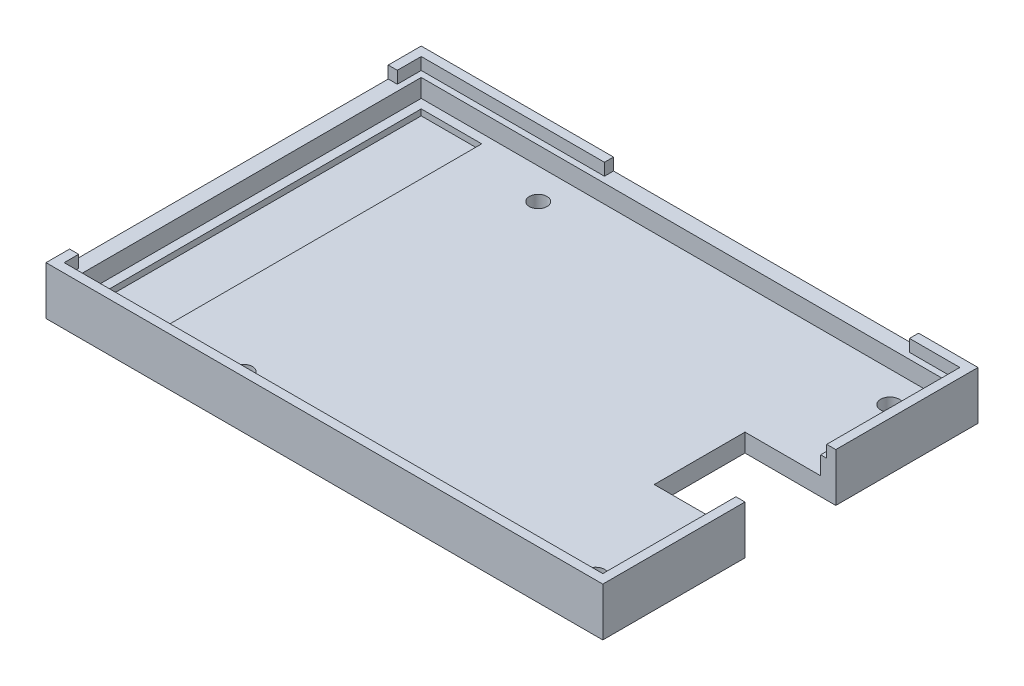
ISO-10303-21;
HEADER;
FILE_DESCRIPTION(('STEP AP214'),'2;1');
FILE_NAME('part.step','',(''),(''),'','','');
FILE_SCHEMA(('AUTOMOTIVE_DESIGN { 1 0 10303 214 1 1 1 1 }'));
ENDSEC;
DATA;
#1=APPLICATION_CONTEXT('core data for automotive mechanical design processes');
#2=APPLICATION_PROTOCOL_DEFINITION('international standard','automotive_design',2000,#1);
#3=PRODUCT_CONTEXT('',#1,'mechanical');
#4=PRODUCT('Part','Part','',(#3));
#5=PRODUCT_RELATED_PRODUCT_CATEGORY('part','',(#4));
#6=PRODUCT_DEFINITION_FORMATION('','',#4);
#7=PRODUCT_DEFINITION_CONTEXT('part definition',#1,'design');
#8=PRODUCT_DEFINITION('design','',#6,#7);
#9=PRODUCT_DEFINITION_SHAPE('','',#8);
#10=(LENGTH_UNIT() NAMED_UNIT(*) SI_UNIT(.MILLI.,.METRE.));
#11=(NAMED_UNIT(*) PLANE_ANGLE_UNIT() SI_UNIT($,.RADIAN.));
#12=(NAMED_UNIT(*) SI_UNIT($,.STERADIAN.) SOLID_ANGLE_UNIT());
#13=UNCERTAINTY_MEASURE_WITH_UNIT(LENGTH_MEASURE(1.E-05),#10,'distance_accuracy_value','');
#14=(GEOMETRIC_REPRESENTATION_CONTEXT(3) GLOBAL_UNCERTAINTY_ASSIGNED_CONTEXT((#13)) GLOBAL_UNIT_ASSIGNED_CONTEXT((#10,
#11,#12)) REPRESENTATION_CONTEXT('',''));
#15=CARTESIAN_POINT('',(0.,0.,0.));
#16=DIRECTION('',(0.,0.,1.));
#17=DIRECTION('',(1.,0.,0.));
#18=AXIS2_PLACEMENT_3D('',#15,#16,#17);
#19=CARTESIAN_POINT('',(0.,8.,0.));
#20=DIRECTION('',(0.,-1.,0.));
#21=DIRECTION('',(0.,0.,-1.));
#22=AXIS2_PLACEMENT_3D('',#19,#20,#21);
#23=PLANE('',#22);
#24=DIRECTION('',(-1.,0.,0.));
#25=VECTOR('',#24,1.);
#26=CARTESIAN_POINT('',(-46.,8.,-31.));
#27=LINE('',#26,#25);
#28=CARTESIAN_POINT('',(46.,8.,-31.));
#29=VERTEX_POINT('',#28);
#30=CARTESIAN_POINT('',(36.1816994349127,8.,-31.));
#31=VERTEX_POINT('',#30);
#32=EDGE_CURVE('E567',#29,#31,#27,.T.);
#33=ORIENTED_EDGE('',*,*,#32,.T.);
#34=DIRECTION('',(0.,0.,-1.));
#35=VECTOR('',#34,1.);
#36=CARTESIAN_POINT('',(36.1816994349127,8.,21.9471277157224));
#37=LINE('',#36,#35);
#38=CARTESIAN_POINT('',(36.1816994349127,8.,-29.5));
#39=VERTEX_POINT('',#38);
#40=EDGE_CURVE('E281',#39,#31,#37,.T.);
#41=ORIENTED_EDGE('',*,*,#40,.F.);
#42=DIRECTION('',(-1.,0.,0.));
#43=VECTOR('',#42,1.);
#44=CARTESIAN_POINT('',(44.5,8.,-29.5));
#45=LINE('',#44,#43);
#46=CARTESIAN_POINT('',(44.5,8.,-29.5));
#47=VERTEX_POINT('',#46);
#48=EDGE_CURVE('E542',#47,#39,#45,.T.);
#49=ORIENTED_EDGE('',*,*,#48,.F.);
#50=DIRECTION('',(0.,0.,-1.));
#51=VECTOR('',#50,1.);
#52=CARTESIAN_POINT('',(44.5,8.,29.5));
#53=LINE('',#52,#51);
#54=CARTESIAN_POINT('',(44.5,8.,-7.5));
#55=VERTEX_POINT('',#54);
#56=EDGE_CURVE('E536',#55,#47,#53,.T.);
#57=ORIENTED_EDGE('',*,*,#56,.F.);
#58=DIRECTION('',(1.,0.,0.));
#59=VECTOR('',#58,1.);
#60=CARTESIAN_POINT('',(14.,8.,-7.5));
#61=LINE('',#60,#59);
#62=CARTESIAN_POINT('',(46.,8.,-7.5));
#63=VERTEX_POINT('',#62);
#64=EDGE_CURVE('E313',#55,#63,#61,.T.);
#65=ORIENTED_EDGE('',*,*,#64,.T.);
#66=DIRECTION('',(0.,0.,-1.));
#67=VECTOR('',#66,1.);
#68=CARTESIAN_POINT('',(46.,8.,31.));
#69=LINE('',#68,#67);
#70=EDGE_CURVE('E566',#63,#29,#69,.T.);
#71=ORIENTED_EDGE('',*,*,#70,.T.);
#72=EDGE_LOOP('',(#33,#41,#49,#57,#65,#71));
#73=FACE_BOUND('',#72,.T.);
#74=ADVANCED_FACE('F51',(#73),#23,.F.);
#75=CARTESIAN_POINT('',(46.,8.,31.));
#76=DIRECTION('',(-1.,0.,0.));
#77=DIRECTION('',(0.,0.,1.));
#78=AXIS2_PLACEMENT_3D('',#75,#76,#77);
#79=PLANE('',#78);
#80=ORIENTED_EDGE('',*,*,#70,.F.);
#81=DIRECTION('',(0.,1.,0.));
#82=VECTOR('',#81,1.);
#83=CARTESIAN_POINT('',(46.,8.,-7.5));
#84=LINE('',#83,#82);
#85=CARTESIAN_POINT('',(46.,0.,-7.5));
#86=VERTEX_POINT('',#85);
#87=EDGE_CURVE('E294',#86,#63,#84,.T.);
#88=ORIENTED_EDGE('',*,*,#87,.F.);
#89=DIRECTION('',(0.,0.,-1.));
#90=VECTOR('',#89,1.);
#91=CARTESIAN_POINT('',(46.,0.,31.));
#92=LINE('',#91,#90);
#93=CARTESIAN_POINT('',(46.,0.,-31.));
#94=VERTEX_POINT('',#93);
#95=EDGE_CURVE('E550',#86,#94,#92,.T.);
#96=ORIENTED_EDGE('',*,*,#95,.T.);
#97=DIRECTION('',(0.,-1.,0.));
#98=VECTOR('',#97,1.);
#99=CARTESIAN_POINT('',(46.,8.,-31.));
#100=LINE('',#99,#98);
#101=EDGE_CURVE('E603',#29,#94,#100,.T.);
#102=ORIENTED_EDGE('',*,*,#101,.F.);
#103=EDGE_LOOP('',(#80,#88,#96,#102));
#104=FACE_BOUND('',#103,.T.);
#105=ADVANCED_FACE('F681',(#104),#79,.F.);
#106=CARTESIAN_POINT('',(44.5,6.,29.5));
#107=DIRECTION('',(1.,0.,0.));
#108=DIRECTION('',(0.,0.,-1.));
#109=AXIS2_PLACEMENT_3D('',#106,#107,#108);
#110=PLANE('',#109);
#111=DIRECTION('',(0.,0.,-1.));
#112=VECTOR('',#111,1.);
#113=CARTESIAN_POINT('',(44.5,6.,29.5));
#114=LINE('',#113,#112);
#115=CARTESIAN_POINT('',(44.5,6.,-7.5));
#116=VERTEX_POINT('',#115);
#117=CARTESIAN_POINT('',(44.5,6.,-29.5));
#118=VERTEX_POINT('',#117);
#119=EDGE_CURVE('E519',#116,#118,#114,.T.);
#120=ORIENTED_EDGE('',*,*,#119,.F.);
#121=DIRECTION('',(0.,1.,0.));
#122=VECTOR('',#121,1.);
#123=CARTESIAN_POINT('',(44.5,6.,-7.5));
#124=LINE('',#123,#122);
#125=EDGE_CURVE('E342',#116,#55,#124,.T.);
#126=ORIENTED_EDGE('',*,*,#125,.T.);
#127=ORIENTED_EDGE('',*,*,#56,.T.);
#128=DIRECTION('',(0.,1.,0.));
#129=VECTOR('',#128,1.);
#130=CARTESIAN_POINT('',(44.5,6.,-29.5));
#131=LINE('',#130,#129);
#132=EDGE_CURVE('E551',#118,#47,#131,.T.);
#133=ORIENTED_EDGE('',*,*,#132,.F.);
#134=EDGE_LOOP('',(#120,#126,#127,#133));
#135=FACE_BOUND('',#134,.T.);
#136=ADVANCED_FACE('F690',(#135),#110,.F.);
#137=CARTESIAN_POINT('',(43.5,3.,28.5));
#138=DIRECTION('',(1.,0.,0.));
#139=DIRECTION('',(0.,0.,-1.));
#140=AXIS2_PLACEMENT_3D('',#137,#138,#139);
#141=PLANE('',#140);
#142=DIRECTION('',(0.,0.,-1.));
#143=VECTOR('',#142,1.);
#144=CARTESIAN_POINT('',(43.5,3.,28.5));
#145=LINE('',#144,#143);
#146=CARTESIAN_POINT('',(43.5,3.,-7.5));
#147=VERTEX_POINT('',#146);
#148=CARTESIAN_POINT('',(43.5,3.,-28.5));
#149=VERTEX_POINT('',#148);
#150=EDGE_CURVE('E468',#147,#149,#145,.T.);
#151=ORIENTED_EDGE('',*,*,#150,.F.);
#152=DIRECTION('',(0.,1.,0.));
#153=VECTOR('',#152,1.);
#154=CARTESIAN_POINT('',(43.5,3.,-7.5));
#155=LINE('',#154,#153);
#156=CARTESIAN_POINT('',(43.5,6.,-7.5));
#157=VERTEX_POINT('',#156);
#158=EDGE_CURVE('E335',#147,#157,#155,.T.);
#159=ORIENTED_EDGE('',*,*,#158,.T.);
#160=DIRECTION('',(0.,0.,-1.));
#161=VECTOR('',#160,1.);
#162=CARTESIAN_POINT('',(43.5,6.,28.5));
#163=LINE('',#162,#161);
#164=CARTESIAN_POINT('',(43.5,6.,-28.5));
#165=VERTEX_POINT('',#164);
#166=EDGE_CURVE('E453',#157,#165,#163,.T.);
#167=ORIENTED_EDGE('',*,*,#166,.T.);
#168=DIRECTION('',(0.,1.,0.));
#169=VECTOR('',#168,1.);
#170=CARTESIAN_POINT('',(43.5,3.,-28.5));
#171=LINE('',#170,#169);
#172=EDGE_CURVE('E480',#149,#165,#171,.T.);
#173=ORIENTED_EDGE('',*,*,#172,.F.);
#174=EDGE_LOOP('',(#151,#159,#167,#173));
#175=FACE_BOUND('',#174,.T.);
#176=ADVANCED_FACE('F654',(#175),#141,.F.);
#177=CARTESIAN_POINT('',(46.,8.,31.));
#178=VERTEX_POINT('',#177);
#179=CARTESIAN_POINT('',(46.,8.,7.5));
#180=VERTEX_POINT('',#179);
#181=EDGE_CURVE('E561',#178,#180,#69,.T.);
#182=ORIENTED_EDGE('',*,*,#181,.T.);
#183=DIRECTION('',(1.,0.,0.));
#184=VECTOR('',#183,1.);
#185=CARTESIAN_POINT('',(14.,8.,7.5));
#186=LINE('',#185,#184);
#187=CARTESIAN_POINT('',(44.5,8.,7.5));
#188=VERTEX_POINT('',#187);
#189=EDGE_CURVE('E308',#188,#180,#186,.T.);
#190=ORIENTED_EDGE('',*,*,#189,.F.);
#191=CARTESIAN_POINT('',(44.5,8.,29.5));
#192=VERTEX_POINT('',#191);
#193=EDGE_CURVE('E537',#192,#188,#53,.T.);
#194=ORIENTED_EDGE('',*,*,#193,.F.);
#195=DIRECTION('',(1.,0.,0.));
#196=VECTOR('',#195,1.);
#197=CARTESIAN_POINT('',(44.5,8.,29.5));
#198=LINE('',#197,#196);
#199=CARTESIAN_POINT('',(-44.5,8.,29.5));
#200=VERTEX_POINT('',#199);
#201=EDGE_CURVE('E532',#200,#192,#198,.T.);
#202=ORIENTED_EDGE('',*,*,#201,.F.);
#203=DIRECTION('',(0.,0.,1.));
#204=VECTOR('',#203,1.);
#205=CARTESIAN_POINT('',(-44.5,8.,29.5));
#206=LINE('',#205,#204);
#207=CARTESIAN_POINT('',(-44.5,8.,27.1057015112773));
#208=VERTEX_POINT('',#207);
#209=EDGE_CURVE('E498',#208,#200,#206,.T.);
#210=ORIENTED_EDGE('',*,*,#209,.F.);
#211=DIRECTION('',(1.,0.,0.));
#212=VECTOR('',#211,1.);
#213=CARTESIAN_POINT('',(-43.5,8.,27.1057015112773));
#214=LINE('',#213,#212);
#215=CARTESIAN_POINT('',(-46.,8.,27.1057015112773));
#216=VERTEX_POINT('',#215);
#217=EDGE_CURVE('E381',#216,#208,#214,.T.);
#218=ORIENTED_EDGE('',*,*,#217,.F.);
#219=DIRECTION('',(0.,0.,1.));
#220=VECTOR('',#219,1.);
#221=CARTESIAN_POINT('',(-46.,8.,31.));
#222=LINE('',#221,#220);
#223=CARTESIAN_POINT('',(-46.,8.,31.));
#224=VERTEX_POINT('',#223);
#225=EDGE_CURVE('E570',#216,#224,#222,.T.);
#226=ORIENTED_EDGE('',*,*,#225,.T.);
#227=DIRECTION('',(1.,0.,0.));
#228=VECTOR('',#227,1.);
#229=CARTESIAN_POINT('',(-46.,8.,31.));
#230=LINE('',#229,#228);
#231=EDGE_CURVE('E575',#224,#178,#230,.T.);
#232=ORIENTED_EDGE('',*,*,#231,.T.);
#233=EDGE_LOOP('',(#182,#190,#194,#202,#210,#218,#226,#232));
#234=FACE_BOUND('',#233,.T.);
#235=ADVANCED_FACE('F631',(#234),#23,.F.);
#236=CARTESIAN_POINT('',(-44.5,6.,29.5));
#237=DIRECTION('',(-1.,0.,0.));
#238=DIRECTION('',(0.,0.,1.));
#239=AXIS2_PLACEMENT_3D('',#236,#237,#238);
#240=PLANE('',#239);
#241=DIRECTION('',(0.,0.,1.));
#242=VECTOR('',#241,1.);
#243=CARTESIAN_POINT('',(-44.5,6.,29.5));
#244=LINE('',#243,#242);
#245=CARTESIAN_POINT('',(-44.5,6.,27.1057015112773));
#246=VERTEX_POINT('',#245);
#247=CARTESIAN_POINT('',(-44.5,6.,29.5));
#248=VERTEX_POINT('',#247);
#249=EDGE_CURVE('E515',#246,#248,#244,.T.);
#250=ORIENTED_EDGE('',*,*,#249,.F.);
#251=DIRECTION('',(0.,1.,0.));
#252=VECTOR('',#251,1.);
#253=CARTESIAN_POINT('',(-44.5,6.,27.1057015112773));
#254=LINE('',#253,#252);
#255=EDGE_CURVE('E414',#246,#208,#254,.T.);
#256=ORIENTED_EDGE('',*,*,#255,.T.);
#257=ORIENTED_EDGE('',*,*,#209,.T.);
#258=DIRECTION('',(0.,1.,0.));
#259=VECTOR('',#258,1.);
#260=CARTESIAN_POINT('',(-44.5,6.,29.5));
#261=LINE('',#260,#259);
#262=EDGE_CURVE('E527',#248,#200,#261,.T.);
#263=ORIENTED_EDGE('',*,*,#262,.F.);
#264=EDGE_LOOP('',(#250,#256,#257,#263));
#265=FACE_BOUND('',#264,.T.);
#266=ADVANCED_FACE('F695',(#265),#240,.F.);
#267=CARTESIAN_POINT('',(44.5,6.,-29.5));
#268=DIRECTION('',(0.,0.,-1.));
#269=DIRECTION('',(-1.,0.,0.));
#270=AXIS2_PLACEMENT_3D('',#267,#268,#269);
#271=PLANE('',#270);
#272=ORIENTED_EDGE('',*,*,#48,.T.);
#273=DIRECTION('',(0.,-1.,0.));
#274=VECTOR('',#273,1.);
#275=CARTESIAN_POINT('',(36.1816994349127,6.,-29.5));
#276=LINE('',#275,#274);
#277=CARTESIAN_POINT('',(36.1816994349127,6.,-29.5));
#278=VERTEX_POINT('',#277);
#279=EDGE_CURVE('E289',#39,#278,#276,.T.);
#280=ORIENTED_EDGE('',*,*,#279,.T.);
#281=DIRECTION('',(-1.,0.,0.));
#282=VECTOR('',#281,1.);
#283=CARTESIAN_POINT('',(44.5,6.,-29.5));
#284=LINE('',#283,#282);
#285=EDGE_CURVE('E277',#118,#278,#284,.T.);
#286=ORIENTED_EDGE('',*,*,#285,.F.);
#287=ORIENTED_EDGE('',*,*,#132,.T.);
#288=EDGE_LOOP('',(#272,#280,#286,#287));
#289=FACE_BOUND('',#288,.T.);
#290=ADVANCED_FACE('F747',(#289),#271,.F.);
#291=CARTESIAN_POINT('',(46.,0.,31.));
#292=VERTEX_POINT('',#291);
#293=CARTESIAN_POINT('',(46.,0.,7.5));
#294=VERTEX_POINT('',#293);
#295=EDGE_CURVE('E579',#292,#294,#92,.T.);
#296=ORIENTED_EDGE('',*,*,#295,.T.);
#297=DIRECTION('',(0.,-1.,0.));
#298=VECTOR('',#297,1.);
#299=CARTESIAN_POINT('',(46.,8.,7.5));
#300=LINE('',#299,#298);
#301=EDGE_CURVE('E293',#180,#294,#300,.T.);
#302=ORIENTED_EDGE('',*,*,#301,.F.);
#303=ORIENTED_EDGE('',*,*,#181,.F.);
#304=DIRECTION('',(0.,-1.,0.));
#305=VECTOR('',#304,1.);
#306=CARTESIAN_POINT('',(46.,8.,31.));
#307=LINE('',#306,#305);
#308=EDGE_CURVE('E578',#178,#292,#307,.T.);
#309=ORIENTED_EDGE('',*,*,#308,.T.);
#310=EDGE_LOOP('',(#296,#302,#303,#309));
#311=FACE_BOUND('',#310,.T.);
#312=ADVANCED_FACE('F53',(#311),#79,.F.);
#313=CARTESIAN_POINT('',(-46.,8.,-31.));
#314=DIRECTION('',(0.,0.,1.));
#315=DIRECTION('',(1.,0.,0.));
#316=AXIS2_PLACEMENT_3D('',#313,#314,#315);
#317=PLANE('',#316);
#318=DIRECTION('',(-1.,0.,0.));
#319=VECTOR('',#318,1.);
#320=CARTESIAN_POINT('',(-9.22576722198651,6.,-31.));
#321=LINE('',#320,#319);
#322=CARTESIAN_POINT('',(36.1816994349127,6.,-31.));
#323=VERTEX_POINT('',#322);
#324=CARTESIAN_POINT('',(-14.2257672219865,6.,-31.));
#325=VERTEX_POINT('',#324);
#326=EDGE_CURVE('E260',#323,#325,#321,.T.);
#327=ORIENTED_EDGE('',*,*,#326,.F.);
#328=DIRECTION('',(0.,-1.,0.));
#329=VECTOR('',#328,1.);
#330=CARTESIAN_POINT('',(36.1816994349127,8.,-31.));
#331=LINE('',#330,#329);
#332=EDGE_CURVE('E265',#31,#323,#331,.T.);
#333=ORIENTED_EDGE('',*,*,#332,.F.);
#334=ORIENTED_EDGE('',*,*,#32,.F.);
#335=ORIENTED_EDGE('',*,*,#101,.T.);
#336=DIRECTION('',(-1.,0.,0.));
#337=VECTOR('',#336,1.);
#338=CARTESIAN_POINT('',(-46.,0.,-31.));
#339=LINE('',#338,#337);
#340=CARTESIAN_POINT('',(-46.,0.,-31.));
#341=VERTEX_POINT('',#340);
#342=EDGE_CURVE('E583',#94,#341,#339,.T.);
#343=ORIENTED_EDGE('',*,*,#342,.T.);
#344=DIRECTION('',(0.,-1.,0.));
#345=VECTOR('',#344,1.);
#346=CARTESIAN_POINT('',(-46.,8.,-31.));
#347=LINE('',#346,#345);
#348=CARTESIAN_POINT('',(-46.,8.,-31.));
#349=VERTEX_POINT('',#348);
#350=EDGE_CURVE('E599',#349,#341,#347,.T.);
#351=ORIENTED_EDGE('',*,*,#350,.F.);
#352=CARTESIAN_POINT('',(-14.2257672219865,8.,-31.));
#353=VERTEX_POINT('',#352);
#354=EDGE_CURVE('E565',#353,#349,#27,.T.);
#355=ORIENTED_EDGE('',*,*,#354,.F.);
#356=DIRECTION('',(0.,1.,0.));
#357=VECTOR('',#356,1.);
#358=CARTESIAN_POINT('',(-14.2257672219865,6.,-31.));
#359=LINE('',#358,#357);
#360=EDGE_CURVE('E268',#325,#353,#359,.T.);
#361=ORIENTED_EDGE('',*,*,#360,.F.);
#362=EDGE_LOOP('',(#327,#333,#334,#335,#343,#351,#355,#361));
#363=FACE_BOUND('',#362,.T.);
#364=ADVANCED_FACE('F262',(#363),#317,.F.);
#365=CARTESIAN_POINT('',(-46.,8.,31.));
#366=DIRECTION('',(1.,0.,0.));
#367=DIRECTION('',(0.,0.,-1.));
#368=AXIS2_PLACEMENT_3D('',#365,#366,#367);
#369=PLANE('',#368);
#370=DIRECTION('',(0.,0.,1.));
#371=VECTOR('',#370,1.);
#372=CARTESIAN_POINT('',(-46.,6.,27.1057015112773));
#373=LINE('',#372,#371);
#374=CARTESIAN_POINT('',(-46.,6.,-25.5515804569084));
#375=VERTEX_POINT('',#374);
#376=CARTESIAN_POINT('',(-46.,6.,27.1057015112773));
#377=VERTEX_POINT('',#376);
#378=EDGE_CURVE('E378',#375,#377,#373,.T.);
#379=ORIENTED_EDGE('',*,*,#378,.F.);
#380=DIRECTION('',(0.,1.,0.));
#381=VECTOR('',#380,1.);
#382=CARTESIAN_POINT('',(-46.,6.,-25.5515804569084));
#383=LINE('',#382,#381);
#384=CARTESIAN_POINT('',(-46.,8.,-25.5515804569084));
#385=VERTEX_POINT('',#384);
#386=EDGE_CURVE('E387',#375,#385,#383,.T.);
#387=ORIENTED_EDGE('',*,*,#386,.T.);
#388=EDGE_CURVE('E571',#349,#385,#222,.T.);
#389=ORIENTED_EDGE('',*,*,#388,.F.);
#390=ORIENTED_EDGE('',*,*,#350,.T.);
#391=DIRECTION('',(0.,0.,1.));
#392=VECTOR('',#391,1.);
#393=CARTESIAN_POINT('',(-46.,0.,31.));
#394=LINE('',#393,#392);
#395=CARTESIAN_POINT('',(-46.,0.,31.));
#396=VERTEX_POINT('',#395);
#397=EDGE_CURVE('E586',#341,#396,#394,.T.);
#398=ORIENTED_EDGE('',*,*,#397,.T.);
#399=DIRECTION('',(0.,-1.,0.));
#400=VECTOR('',#399,1.);
#401=CARTESIAN_POINT('',(-46.,8.,31.));
#402=LINE('',#401,#400);
#403=EDGE_CURVE('E595',#224,#396,#402,.T.);
#404=ORIENTED_EDGE('',*,*,#403,.F.);
#405=ORIENTED_EDGE('',*,*,#225,.F.);
#406=DIRECTION('',(0.,1.,0.));
#407=VECTOR('',#406,1.);
#408=CARTESIAN_POINT('',(-46.,6.,27.1057015112773));
#409=LINE('',#408,#407);
#410=EDGE_CURVE('E384',#377,#216,#409,.T.);
#411=ORIENTED_EDGE('',*,*,#410,.F.);
#412=EDGE_LOOP('',(#379,#387,#389,#390,#398,#404,#405,#411));
#413=FACE_BOUND('',#412,.T.);
#414=ADVANCED_FACE('F705',(#413),#369,.F.);
#415=CARTESIAN_POINT('',(-46.,8.,31.));
#416=DIRECTION('',(0.,0.,-1.));
#417=DIRECTION('',(-1.,0.,0.));
#418=AXIS2_PLACEMENT_3D('',#415,#416,#417);
#419=PLANE('',#418);
#420=DIRECTION('',(1.,0.,0.));
#421=VECTOR('',#420,1.);
#422=CARTESIAN_POINT('',(-46.,0.,31.));
#423=LINE('',#422,#421);
#424=EDGE_CURVE('E589',#396,#292,#423,.T.);
#425=ORIENTED_EDGE('',*,*,#424,.T.);
#426=ORIENTED_EDGE('',*,*,#308,.F.);
#427=ORIENTED_EDGE('',*,*,#231,.F.);
#428=ORIENTED_EDGE('',*,*,#403,.T.);
#429=EDGE_LOOP('',(#425,#426,#427,#428));
#430=FACE_BOUND('',#429,.T.);
#431=ADVANCED_FACE('F697',(#430),#419,.F.);
#432=CARTESIAN_POINT('',(-14.2257672219865,8.,-29.5));
#433=VERTEX_POINT('',#432);
#434=CARTESIAN_POINT('',(-44.5,8.,-29.5));
#435=VERTEX_POINT('',#434);
#436=EDGE_CURVE('E541',#433,#435,#45,.T.);
#437=ORIENTED_EDGE('',*,*,#436,.F.);
#438=DIRECTION('',(0.,0.,1.));
#439=VECTOR('',#438,1.);
#440=CARTESIAN_POINT('',(-14.2257672219865,8.,-31.));
#441=LINE('',#440,#439);
#442=EDGE_CURVE('E270',#353,#433,#441,.T.);
#443=ORIENTED_EDGE('',*,*,#442,.F.);
#444=ORIENTED_EDGE('',*,*,#354,.T.);
#445=ORIENTED_EDGE('',*,*,#388,.T.);
#446=DIRECTION('',(-1.,0.,0.));
#447=VECTOR('',#446,1.);
#448=CARTESIAN_POINT('',(-43.5,8.,-25.5515804569084));
#449=LINE('',#448,#447);
#450=CARTESIAN_POINT('',(-44.5,8.,-25.5515804569084));
#451=VERTEX_POINT('',#450);
#452=EDGE_CURVE('E397',#451,#385,#449,.T.);
#453=ORIENTED_EDGE('',*,*,#452,.F.);
#454=EDGE_CURVE('E528',#435,#451,#206,.T.);
#455=ORIENTED_EDGE('',*,*,#454,.F.);
#456=EDGE_LOOP('',(#437,#443,#444,#445,#453,#455));
#457=FACE_BOUND('',#456,.T.);
#458=ADVANCED_FACE('F684',(#457),#23,.F.);
#459=CARTESIAN_POINT('',(0.,0.,0.));
#460=DIRECTION('',(0.,-1.,0.));
#461=DIRECTION('',(0.,0.,-1.));
#462=AXIS2_PLACEMENT_3D('',#459,#460,#461);
#463=PLANE('',#462);
#464=DIRECTION('',(1.,0.,0.));
#465=VECTOR('',#464,1.);
#466=CARTESIAN_POINT('',(14.,0.,-7.5));
#467=LINE('',#466,#465);
#468=CARTESIAN_POINT('',(31.,0.,-7.5));
#469=VERTEX_POINT('',#468);
#470=EDGE_CURVE('E303',#469,#86,#467,.T.);
#471=ORIENTED_EDGE('',*,*,#470,.F.);
#472=DIRECTION('',(0.,0.,-1.));
#473=VECTOR('',#472,1.);
#474=CARTESIAN_POINT('',(31.,0.,7.5));
#475=LINE('',#474,#473);
#476=CARTESIAN_POINT('',(31.,0.,7.5));
#477=VERTEX_POINT('',#476);
#478=EDGE_CURVE('E297',#477,#469,#475,.T.);
#479=ORIENTED_EDGE('',*,*,#478,.F.);
#480=DIRECTION('',(1.,0.,0.));
#481=VECTOR('',#480,1.);
#482=CARTESIAN_POINT('',(14.,0.,7.5));
#483=LINE('',#482,#481);
#484=EDGE_CURVE('E307',#477,#294,#483,.T.);
#485=ORIENTED_EDGE('',*,*,#484,.T.);
#486=ORIENTED_EDGE('',*,*,#295,.F.);
#487=ORIENTED_EDGE('',*,*,#424,.F.);
#488=ORIENTED_EDGE('',*,*,#397,.F.);
#489=ORIENTED_EDGE('',*,*,#342,.F.);
#490=ORIENTED_EDGE('',*,*,#95,.F.);
#491=EDGE_LOOP('',(#471,#479,#485,#486,#487,#488,#489,#490));
#492=FACE_BOUND('',#491,.T.);
#493=CARTESIAN_POINT('',(-19.0815249321155,0.,25.2383799449528));
#494=DIRECTION('',(0.,-1.,0.));
#495=DIRECTION('',(0.,0.,-1.));
#496=AXIS2_PLACEMENT_3D('',#493,#494,#495);
#497=CIRCLE('',#496,1.43611711218536);
#498=CARTESIAN_POINT('',(-19.0815249321155,0.,23.8022628327674));
#499=VERTEX_POINT('',#498);
#500=EDGE_CURVE('E374',#499,#499,#497,.T.);
#501=ORIENTED_EDGE('',*,*,#500,.F.);
#502=EDGE_LOOP('',(#501));
#503=FACE_BOUND('',#502,.T.);
#504=CARTESIAN_POINT('',(39.0422374757254,0.,-23.4108319171611));
#505=DIRECTION('',(0.,-1.,0.));
#506=DIRECTION('',(0.,0.,-1.));
#507=AXIS2_PLACEMENT_3D('',#504,#505,#506);
#508=CIRCLE('',#507,1.5410563295679);
#509=CARTESIAN_POINT('',(39.0422374757254,0.,-24.951888246729));
#510=VERTEX_POINT('',#509);
#511=EDGE_CURVE('E370',#510,#510,#508,.T.);
#512=ORIENTED_EDGE('',*,*,#511,.F.);
#513=EDGE_LOOP('',(#512));
#514=FACE_BOUND('',#513,.T.);
#515=CARTESIAN_POINT('',(-19.0815249321155,0.,-23.4108319171611));
#516=DIRECTION('',(0.,-1.,0.));
#517=DIRECTION('',(0.,0.,-1.));
#518=AXIS2_PLACEMENT_3D('',#515,#516,#517);
#519=CIRCLE('',#518,1.45464715549989);
#520=CARTESIAN_POINT('',(-19.0815249321155,0.,-24.865479072661));
#521=VERTEX_POINT('',#520);
#522=EDGE_CURVE('E366',#521,#521,#519,.T.);
#523=ORIENTED_EDGE('',*,*,#522,.F.);
#524=EDGE_LOOP('',(#523));
#525=FACE_BOUND('',#524,.T.);
#526=CARTESIAN_POINT('',(39.0422374757254,0.,25.2383799449528));
#527=DIRECTION('',(0.,-1.,0.));
#528=DIRECTION('',(0.,0.,-1.));
#529=AXIS2_PLACEMENT_3D('',#526,#527,#528);
#530=CIRCLE('',#529,1.49235409230014);
#531=CARTESIAN_POINT('',(39.0422374757254,0.,23.7460258526527));
#532=VERTEX_POINT('',#531);
#533=EDGE_CURVE('E362',#532,#532,#530,.T.);
#534=ORIENTED_EDGE('',*,*,#533,.F.);
#535=EDGE_LOOP('',(#534));
#536=FACE_BOUND('',#535,.T.);
#537=ADVANCED_FACE('F641',(#492,#503,#514,#525,#536),#463,.T.);
#538=ORIENTED_EDGE('',*,*,#454,.T.);
#539=DIRECTION('',(0.,-1.,0.));
#540=VECTOR('',#539,1.);
#541=CARTESIAN_POINT('',(-44.5,6.,-25.5515804569084));
#542=LINE('',#541,#540);
#543=CARTESIAN_POINT('',(-44.5,6.,-25.5515804569084));
#544=VERTEX_POINT('',#543);
#545=EDGE_CURVE('E389',#451,#544,#542,.T.);
#546=ORIENTED_EDGE('',*,*,#545,.T.);
#547=CARTESIAN_POINT('',(-44.5,6.,-29.5));
#548=VERTEX_POINT('',#547);
#549=EDGE_CURVE('E510',#548,#544,#244,.T.);
#550=ORIENTED_EDGE('',*,*,#549,.F.);
#551=DIRECTION('',(0.,1.,0.));
#552=VECTOR('',#551,1.);
#553=CARTESIAN_POINT('',(-44.5,6.,-29.5));
#554=LINE('',#553,#552);
#555=EDGE_CURVE('E546',#548,#435,#554,.T.);
#556=ORIENTED_EDGE('',*,*,#555,.T.);
#557=EDGE_LOOP('',(#538,#546,#550,#556));
#558=FACE_BOUND('',#557,.T.);
#559=ADVANCED_FACE('F704',(#558),#240,.F.);
#560=CARTESIAN_POINT('',(-14.2257672219865,6.,-29.5));
#561=VERTEX_POINT('',#560);
#562=EDGE_CURVE('E524',#561,#548,#284,.T.);
#563=ORIENTED_EDGE('',*,*,#562,.F.);
#564=DIRECTION('',(0.,1.,0.));
#565=VECTOR('',#564,1.);
#566=CARTESIAN_POINT('',(-14.2257672219865,6.,-29.5));
#567=LINE('',#566,#565);
#568=EDGE_CURVE('E410',#561,#433,#567,.T.);
#569=ORIENTED_EDGE('',*,*,#568,.T.);
#570=ORIENTED_EDGE('',*,*,#436,.T.);
#571=ORIENTED_EDGE('',*,*,#555,.F.);
#572=EDGE_LOOP('',(#563,#569,#570,#571));
#573=FACE_BOUND('',#572,.T.);
#574=ADVANCED_FACE('F749',(#573),#271,.F.);
#575=ORIENTED_EDGE('',*,*,#193,.T.);
#576=DIRECTION('',(0.,-1.,0.));
#577=VECTOR('',#576,1.);
#578=CARTESIAN_POINT('',(44.5,6.,7.5));
#579=LINE('',#578,#577);
#580=CARTESIAN_POINT('',(44.5,6.,7.5));
#581=VERTEX_POINT('',#580);
#582=EDGE_CURVE('E331',#188,#581,#579,.T.);
#583=ORIENTED_EDGE('',*,*,#582,.T.);
#584=CARTESIAN_POINT('',(44.5,6.,29.5));
#585=VERTEX_POINT('',#584);
#586=EDGE_CURVE('E520',#585,#581,#114,.T.);
#587=ORIENTED_EDGE('',*,*,#586,.F.);
#588=DIRECTION('',(0.,1.,0.));
#589=VECTOR('',#588,1.);
#590=CARTESIAN_POINT('',(44.5,6.,29.5));
#591=LINE('',#590,#589);
#592=EDGE_CURVE('E555',#585,#192,#591,.T.);
#593=ORIENTED_EDGE('',*,*,#592,.T.);
#594=EDGE_LOOP('',(#575,#583,#587,#593));
#595=FACE_BOUND('',#594,.T.);
#596=ADVANCED_FACE('F627',(#595),#110,.F.);
#597=CARTESIAN_POINT('',(44.5,6.,29.5));
#598=DIRECTION('',(0.,0.,1.));
#599=DIRECTION('',(1.,0.,0.));
#600=AXIS2_PLACEMENT_3D('',#597,#598,#599);
#601=PLANE('',#600);
#602=ORIENTED_EDGE('',*,*,#201,.T.);
#603=ORIENTED_EDGE('',*,*,#592,.F.);
#604=DIRECTION('',(1.,0.,0.));
#605=VECTOR('',#604,1.);
#606=CARTESIAN_POINT('',(44.5,6.,29.5));
#607=LINE('',#606,#605);
#608=EDGE_CURVE('E514',#248,#585,#607,.T.);
#609=ORIENTED_EDGE('',*,*,#608,.F.);
#610=ORIENTED_EDGE('',*,*,#262,.T.);
#611=EDGE_LOOP('',(#602,#603,#609,#610));
#612=FACE_BOUND('',#611,.T.);
#613=ADVANCED_FACE('F724',(#612),#601,.F.);
#614=CARTESIAN_POINT('',(0.,6.,0.));
#615=DIRECTION('',(0.,1.,0.));
#616=DIRECTION('',(0.,0.,1.));
#617=AXIS2_PLACEMENT_3D('',#614,#615,#616);
#618=PLANE('',#617);
#619=DIRECTION('',(1.,0.,0.));
#620=VECTOR('',#619,1.);
#621=CARTESIAN_POINT('',(-43.5,6.,28.5));
#622=LINE('',#621,#620);
#623=CARTESIAN_POINT('',(-43.5,6.,28.5));
#624=VERTEX_POINT('',#623);
#625=CARTESIAN_POINT('',(43.5,6.,28.5));
#626=VERTEX_POINT('',#625);
#627=EDGE_CURVE('E491',#624,#626,#622,.T.);
#628=ORIENTED_EDGE('',*,*,#627,.F.);
#629=DIRECTION('',(0.,0.,1.));
#630=VECTOR('',#629,1.);
#631=CARTESIAN_POINT('',(-43.5,6.,28.5));
#632=LINE('',#631,#630);
#633=CARTESIAN_POINT('',(-43.5,6.,-28.5));
#634=VERTEX_POINT('',#633);
#635=EDGE_CURVE('E488',#634,#624,#632,.T.);
#636=ORIENTED_EDGE('',*,*,#635,.F.);
#637=DIRECTION('',(-1.,0.,0.));
#638=VECTOR('',#637,1.);
#639=CARTESIAN_POINT('',(-43.5,6.,-28.5));
#640=LINE('',#639,#638);
#641=EDGE_CURVE('E485',#165,#634,#640,.T.);
#642=ORIENTED_EDGE('',*,*,#641,.F.);
#643=ORIENTED_EDGE('',*,*,#166,.F.);
#644=DIRECTION('',(-1.,0.,0.));
#645=VECTOR('',#644,1.);
#646=CARTESIAN_POINT('',(0.,6.,-7.5));
#647=LINE('',#646,#645);
#648=EDGE_CURVE('E339',#116,#157,#647,.T.);
#649=ORIENTED_EDGE('',*,*,#648,.F.);
#650=ORIENTED_EDGE('',*,*,#119,.T.);
#651=ORIENTED_EDGE('',*,*,#285,.T.);
#652=DIRECTION('',(0.,0.,-1.));
#653=VECTOR('',#652,1.);
#654=CARTESIAN_POINT('',(36.1816994349127,6.,21.9471277157224));
#655=LINE('',#654,#653);
#656=EDGE_CURVE('E273',#278,#323,#655,.T.);
#657=ORIENTED_EDGE('',*,*,#656,.T.);
#658=ORIENTED_EDGE('',*,*,#326,.T.);
#659=DIRECTION('',(0.,0.,1.));
#660=VECTOR('',#659,1.);
#661=CARTESIAN_POINT('',(-14.2257672219865,6.,-31.));
#662=LINE('',#661,#660);
#663=EDGE_CURVE('E67',#325,#561,#662,.T.);
#664=ORIENTED_EDGE('',*,*,#663,.T.);
#665=ORIENTED_EDGE('',*,*,#562,.T.);
#666=ORIENTED_EDGE('',*,*,#549,.T.);
#667=DIRECTION('',(-1.,0.,0.));
#668=VECTOR('',#667,1.);
#669=CARTESIAN_POINT('',(-43.5,6.,-25.5515804569084));
#670=LINE('',#669,#668);
#671=EDGE_CURVE('E398',#544,#375,#670,.T.);
#672=ORIENTED_EDGE('',*,*,#671,.T.);
#673=ORIENTED_EDGE('',*,*,#378,.T.);
#674=DIRECTION('',(1.,0.,0.));
#675=VECTOR('',#674,1.);
#676=CARTESIAN_POINT('',(-43.5,6.,27.1057015112773));
#677=LINE('',#676,#675);
#678=EDGE_CURVE('E74',#377,#246,#677,.T.);
#679=ORIENTED_EDGE('',*,*,#678,.T.);
#680=ORIENTED_EDGE('',*,*,#249,.T.);
#681=ORIENTED_EDGE('',*,*,#608,.T.);
#682=ORIENTED_EDGE('',*,*,#586,.T.);
#683=DIRECTION('',(1.,0.,0.));
#684=VECTOR('',#683,1.);
#685=CARTESIAN_POINT('',(0.,6.,7.5));
#686=LINE('',#685,#684);
#687=CARTESIAN_POINT('',(43.5,6.,7.5));
#688=VERTEX_POINT('',#687);
#689=EDGE_CURVE('E328',#688,#581,#686,.T.);
#690=ORIENTED_EDGE('',*,*,#689,.F.);
#691=EDGE_CURVE('E481',#626,#688,#163,.T.);
#692=ORIENTED_EDGE('',*,*,#691,.F.);
#693=EDGE_LOOP('',(#628,#636,#642,#643,#649,#650,#651,#657,#658,#664,#665,#666,#672,#673,#679,
#680,#681,#682,#690,#692));
#694=FACE_BOUND('',#693,.T.);
#695=ADVANCED_FACE('F275',(#694),#618,.T.);
#696=ORIENTED_EDGE('',*,*,#691,.T.);
#697=DIRECTION('',(0.,-1.,0.));
#698=VECTOR('',#697,1.);
#699=CARTESIAN_POINT('',(43.5,3.,7.5));
#700=LINE('',#699,#698);
#701=CARTESIAN_POINT('',(43.5,3.,7.5));
#702=VERTEX_POINT('',#701);
#703=EDGE_CURVE('E324',#688,#702,#700,.T.);
#704=ORIENTED_EDGE('',*,*,#703,.T.);
#705=CARTESIAN_POINT('',(43.5,3.,28.5));
#706=VERTEX_POINT('',#705);
#707=EDGE_CURVE('E463',#706,#702,#145,.T.);
#708=ORIENTED_EDGE('',*,*,#707,.F.);
#709=DIRECTION('',(0.,1.,0.));
#710=VECTOR('',#709,1.);
#711=CARTESIAN_POINT('',(43.5,3.,28.5));
#712=LINE('',#711,#710);
#713=EDGE_CURVE('E495',#706,#626,#712,.T.);
#714=ORIENTED_EDGE('',*,*,#713,.T.);
#715=EDGE_LOOP('',(#696,#704,#708,#714));
#716=FACE_BOUND('',#715,.T.);
#717=ADVANCED_FACE('F621',(#716),#141,.F.);
#718=CARTESIAN_POINT('',(-43.5,3.,28.5));
#719=DIRECTION('',(0.,0.,1.));
#720=DIRECTION('',(1.,0.,0.));
#721=AXIS2_PLACEMENT_3D('',#718,#719,#720);
#722=PLANE('',#721);
#723=ORIENTED_EDGE('',*,*,#627,.T.);
#724=ORIENTED_EDGE('',*,*,#713,.F.);
#725=DIRECTION('',(1.,0.,0.));
#726=VECTOR('',#725,1.);
#727=CARTESIAN_POINT('',(-43.5,3.,28.5));
#728=LINE('',#727,#726);
#729=CARTESIAN_POINT('',(-43.5,3.,28.5));
#730=VERTEX_POINT('',#729);
#731=EDGE_CURVE('E476',#730,#706,#728,.T.);
#732=ORIENTED_EDGE('',*,*,#731,.F.);
#733=DIRECTION('',(0.,1.,0.));
#734=VECTOR('',#733,1.);
#735=CARTESIAN_POINT('',(-43.5,3.,28.5));
#736=LINE('',#735,#734);
#737=EDGE_CURVE('E499',#730,#624,#736,.T.);
#738=ORIENTED_EDGE('',*,*,#737,.T.);
#739=EDGE_LOOP('',(#723,#724,#732,#738));
#740=FACE_BOUND('',#739,.T.);
#741=ADVANCED_FACE('F668',(#740),#722,.F.);
#742=CARTESIAN_POINT('',(-43.5,3.,28.5));
#743=DIRECTION('',(-1.,0.,0.));
#744=DIRECTION('',(0.,0.,1.));
#745=AXIS2_PLACEMENT_3D('',#742,#743,#744);
#746=PLANE('',#745);
#747=ORIENTED_EDGE('',*,*,#635,.T.);
#748=ORIENTED_EDGE('',*,*,#737,.F.);
#749=DIRECTION('',(0.,0.,1.));
#750=VECTOR('',#749,1.);
#751=CARTESIAN_POINT('',(-43.5,3.,28.5));
#752=LINE('',#751,#750);
#753=CARTESIAN_POINT('',(-43.5,3.,-28.5));
#754=VERTEX_POINT('',#753);
#755=EDGE_CURVE('E472',#754,#730,#752,.T.);
#756=ORIENTED_EDGE('',*,*,#755,.F.);
#757=DIRECTION('',(0.,1.,0.));
#758=VECTOR('',#757,1.);
#759=CARTESIAN_POINT('',(-43.5,3.,-28.5));
#760=LINE('',#759,#758);
#761=EDGE_CURVE('E503',#754,#634,#760,.T.);
#762=ORIENTED_EDGE('',*,*,#761,.T.);
#763=EDGE_LOOP('',(#747,#748,#756,#762));
#764=FACE_BOUND('',#763,.T.);
#765=ADVANCED_FACE('F664',(#764),#746,.F.);
#766=CARTESIAN_POINT('',(-43.5,3.,-28.5));
#767=DIRECTION('',(0.,0.,-1.));
#768=DIRECTION('',(-1.,0.,0.));
#769=AXIS2_PLACEMENT_3D('',#766,#767,#768);
#770=PLANE('',#769);
#771=ORIENTED_EDGE('',*,*,#641,.T.);
#772=ORIENTED_EDGE('',*,*,#761,.F.);
#773=DIRECTION('',(-1.,0.,0.));
#774=VECTOR('',#773,1.);
#775=CARTESIAN_POINT('',(-43.5,3.,-28.5));
#776=LINE('',#775,#774);
#777=EDGE_CURVE('E467',#149,#754,#776,.T.);
#778=ORIENTED_EDGE('',*,*,#777,.F.);
#779=ORIENTED_EDGE('',*,*,#172,.T.);
#780=EDGE_LOOP('',(#771,#772,#778,#779));
#781=FACE_BOUND('',#780,.T.);
#782=ADVANCED_FACE('F662',(#781),#770,.F.);
#783=CARTESIAN_POINT('',(0.,3.,0.));
#784=DIRECTION('',(0.,-1.,0.));
#785=DIRECTION('',(0.,0.,-1.));
#786=AXIS2_PLACEMENT_3D('',#783,#784,#785);
#787=PLANE('',#786);
#788=CARTESIAN_POINT('',(-19.0815249321155,3.,25.2383799449528));
#789=DIRECTION('',(0.,1.,0.));
#790=DIRECTION('',(0.,0.,1.));
#791=AXIS2_PLACEMENT_3D('',#788,#789,#790);
#792=CIRCLE('',#791,1.43611711218536);
#793=CARTESIAN_POINT('',(-19.0815249321155,3.,26.6744970571382));
#794=VERTEX_POINT('',#793);
#795=EDGE_CURVE('E346',#794,#794,#792,.T.);
#796=ORIENTED_EDGE('',*,*,#795,.F.);
#797=EDGE_LOOP('',(#796));
#798=FACE_BOUND('',#797,.T.);
#799=CARTESIAN_POINT('',(39.0422374757254,3.,-23.4108319171611));
#800=DIRECTION('',(0.,1.,0.));
#801=DIRECTION('',(0.,0.,1.));
#802=AXIS2_PLACEMENT_3D('',#799,#800,#801);
#803=CIRCLE('',#802,1.5410563295679);
#804=CARTESIAN_POINT('',(39.0422374757254,3.,-21.8697755875932));
#805=VERTEX_POINT('',#804);
#806=EDGE_CURVE('E352',#805,#805,#803,.T.);
#807=ORIENTED_EDGE('',*,*,#806,.F.);
#808=EDGE_LOOP('',(#807));
#809=FACE_BOUND('',#808,.T.);
#810=CARTESIAN_POINT('',(-19.0815249321155,3.,-23.4108319171611));
#811=DIRECTION('',(0.,1.,0.));
#812=DIRECTION('',(0.,0.,1.));
#813=AXIS2_PLACEMENT_3D('',#810,#811,#812);
#814=CIRCLE('',#813,1.45464715549989);
#815=CARTESIAN_POINT('',(-19.0815249321155,3.,-21.9561847616612));
#816=VERTEX_POINT('',#815);
#817=EDGE_CURVE('E347',#816,#816,#814,.T.);
#818=ORIENTED_EDGE('',*,*,#817,.F.);
#819=EDGE_LOOP('',(#818));
#820=FACE_BOUND('',#819,.T.);
#821=CARTESIAN_POINT('',(39.0422374757254,3.,25.2383799449528));
#822=DIRECTION('',(0.,1.,0.));
#823=DIRECTION('',(0.,0.,1.));
#824=AXIS2_PLACEMENT_3D('',#821,#822,#823);
#825=CIRCLE('',#824,1.49235409230014);
#826=CARTESIAN_POINT('',(39.0422374757254,3.,26.7307340372529));
#827=VERTEX_POINT('',#826);
#828=EDGE_CURVE('E351',#827,#827,#825,.T.);
#829=ORIENTED_EDGE('',*,*,#828,.F.);
#830=EDGE_LOOP('',(#829));
#831=FACE_BOUND('',#830,.T.);
#832=DIRECTION('',(1.,0.,0.));
#833=VECTOR('',#832,1.);
#834=CARTESIAN_POINT('',(-32.,3.,26.632525492723));
#835=LINE('',#834,#833);
#836=CARTESIAN_POINT('',(-42.,3.,26.632525492723));
#837=VERTEX_POINT('',#836);
#838=CARTESIAN_POINT('',(-32.,3.,26.632525492723));
#839=VERTEX_POINT('',#838);
#840=EDGE_CURVE('E439',#837,#839,#835,.T.);
#841=ORIENTED_EDGE('',*,*,#840,.F.);
#842=DIRECTION('',(0.,0.,1.));
#843=VECTOR('',#842,1.);
#844=CARTESIAN_POINT('',(-42.,3.,26.632525492723));
#845=LINE('',#844,#843);
#846=CARTESIAN_POINT('',(-42.,3.,-27.));
#847=VERTEX_POINT('',#846);
#848=EDGE_CURVE('E418',#847,#837,#845,.T.);
#849=ORIENTED_EDGE('',*,*,#848,.F.);
#850=DIRECTION('',(-1.,0.,0.));
#851=VECTOR('',#850,1.);
#852=CARTESIAN_POINT('',(-32.,3.,-27.));
#853=LINE('',#852,#851);
#854=CARTESIAN_POINT('',(-32.,3.,-27.));
#855=VERTEX_POINT('',#854);
#856=EDGE_CURVE('E424',#855,#847,#853,.T.);
#857=ORIENTED_EDGE('',*,*,#856,.F.);
#858=DIRECTION('',(0.,0.,-1.));
#859=VECTOR('',#858,1.);
#860=CARTESIAN_POINT('',(-32.,3.,26.632525492723));
#861=LINE('',#860,#859);
#862=EDGE_CURVE('E443',#839,#855,#861,.T.);
#863=ORIENTED_EDGE('',*,*,#862,.F.);
#864=EDGE_LOOP('',(#841,#849,#857,#863));
#865=FACE_BOUND('',#864,.T.);
#866=DIRECTION('',(0.,0.,-1.));
#867=VECTOR('',#866,1.);
#868=CARTESIAN_POINT('',(31.,3.,0.));
#869=LINE('',#868,#867);
#870=CARTESIAN_POINT('',(31.,3.,7.5));
#871=VERTEX_POINT('',#870);
#872=CARTESIAN_POINT('',(31.,3.,-7.5));
#873=VERTEX_POINT('',#872);
#874=EDGE_CURVE('E607',#871,#873,#869,.T.);
#875=ORIENTED_EDGE('',*,*,#874,.T.);
#876=DIRECTION('',(1.,0.,0.));
#877=VECTOR('',#876,1.);
#878=CARTESIAN_POINT('',(0.,3.,-7.5));
#879=LINE('',#878,#877);
#880=EDGE_CURVE('E13',#873,#147,#879,.T.);
#881=ORIENTED_EDGE('',*,*,#880,.T.);
#882=ORIENTED_EDGE('',*,*,#150,.T.);
#883=ORIENTED_EDGE('',*,*,#777,.T.);
#884=ORIENTED_EDGE('',*,*,#755,.T.);
#885=ORIENTED_EDGE('',*,*,#731,.T.);
#886=ORIENTED_EDGE('',*,*,#707,.T.);
#887=DIRECTION('',(-1.,0.,0.));
#888=VECTOR('',#887,1.);
#889=CARTESIAN_POINT('',(0.,3.,7.5));
#890=LINE('',#889,#888);
#891=EDGE_CURVE('E60',#702,#871,#890,.T.);
#892=ORIENTED_EDGE('',*,*,#891,.T.);
#893=EDGE_LOOP('',(#875,#881,#882,#883,#884,#885,#886,#892));
#894=FACE_BOUND('',#893,.T.);
#895=ADVANCED_FACE('F612',(#798,#809,#820,#831,#865,#894),#787,.F.);
#896=CARTESIAN_POINT('',(-42.,2.,26.632525492723));
#897=DIRECTION('',(-1.,0.,0.));
#898=DIRECTION('',(0.,0.,1.));
#899=AXIS2_PLACEMENT_3D('',#896,#897,#898);
#900=PLANE('',#899);
#901=ORIENTED_EDGE('',*,*,#848,.T.);
#902=DIRECTION('',(0.,1.,0.));
#903=VECTOR('',#902,1.);
#904=CARTESIAN_POINT('',(-42.,2.,26.632525492723));
#905=LINE('',#904,#903);
#906=CARTESIAN_POINT('',(-42.,2.,26.632525492723));
#907=VERTEX_POINT('',#906);
#908=EDGE_CURVE('E436',#907,#837,#905,.T.);
#909=ORIENTED_EDGE('',*,*,#908,.F.);
#910=DIRECTION('',(0.,0.,1.));
#911=VECTOR('',#910,1.);
#912=CARTESIAN_POINT('',(-42.,2.,26.632525492723));
#913=LINE('',#912,#911);
#914=CARTESIAN_POINT('',(-42.,2.,-27.));
#915=VERTEX_POINT('',#914);
#916=EDGE_CURVE('E419',#915,#907,#913,.T.);
#917=ORIENTED_EDGE('',*,*,#916,.F.);
#918=DIRECTION('',(0.,1.,0.));
#919=VECTOR('',#918,1.);
#920=CARTESIAN_POINT('',(-42.,2.,-27.));
#921=LINE('',#920,#919);
#922=EDGE_CURVE('E450',#915,#847,#921,.T.);
#923=ORIENTED_EDGE('',*,*,#922,.T.);
#924=EDGE_LOOP('',(#901,#909,#917,#923));
#925=FACE_BOUND('',#924,.T.);
#926=ADVANCED_FACE('F799',(#925),#900,.F.);
#927=CARTESIAN_POINT('',(-32.,2.,-27.));
#928=DIRECTION('',(0.,0.,-1.));
#929=DIRECTION('',(-1.,0.,0.));
#930=AXIS2_PLACEMENT_3D('',#927,#928,#929);
#931=PLANE('',#930);
#932=ORIENTED_EDGE('',*,*,#856,.T.);
#933=ORIENTED_EDGE('',*,*,#922,.F.);
#934=DIRECTION('',(-1.,0.,0.));
#935=VECTOR('',#934,1.);
#936=CARTESIAN_POINT('',(-32.,2.,-27.));
#937=LINE('',#936,#935);
#938=CARTESIAN_POINT('',(-32.,2.,-27.));
#939=VERTEX_POINT('',#938);
#940=EDGE_CURVE('E432',#939,#915,#937,.T.);
#941=ORIENTED_EDGE('',*,*,#940,.F.);
#942=DIRECTION('',(0.,1.,0.));
#943=VECTOR('',#942,1.);
#944=CARTESIAN_POINT('',(-32.,2.,-27.));
#945=LINE('',#944,#943);
#946=EDGE_CURVE('E454',#939,#855,#945,.T.);
#947=ORIENTED_EDGE('',*,*,#946,.T.);
#948=EDGE_LOOP('',(#932,#933,#941,#947));
#949=FACE_BOUND('',#948,.T.);
#950=ADVANCED_FACE('F795',(#949),#931,.F.);
#951=CARTESIAN_POINT('',(-32.,2.,26.632525492723));
#952=DIRECTION('',(1.,0.,0.));
#953=DIRECTION('',(0.,0.,-1.));
#954=AXIS2_PLACEMENT_3D('',#951,#952,#953);
#955=PLANE('',#954);
#956=ORIENTED_EDGE('',*,*,#862,.T.);
#957=ORIENTED_EDGE('',*,*,#946,.F.);
#958=DIRECTION('',(0.,0.,-1.));
#959=VECTOR('',#958,1.);
#960=CARTESIAN_POINT('',(-32.,2.,26.632525492723));
#961=LINE('',#960,#959);
#962=CARTESIAN_POINT('',(-32.,2.,26.632525492723));
#963=VERTEX_POINT('',#962);
#964=EDGE_CURVE('E428',#963,#939,#961,.T.);
#965=ORIENTED_EDGE('',*,*,#964,.F.);
#966=DIRECTION('',(0.,1.,0.));
#967=VECTOR('',#966,1.);
#968=CARTESIAN_POINT('',(-32.,2.,26.632525492723));
#969=LINE('',#968,#967);
#970=EDGE_CURVE('E457',#963,#839,#969,.T.);
#971=ORIENTED_EDGE('',*,*,#970,.T.);
#972=EDGE_LOOP('',(#956,#957,#965,#971));
#973=FACE_BOUND('',#972,.T.);
#974=ADVANCED_FACE('F798',(#973),#955,.F.);
#975=CARTESIAN_POINT('',(-32.,2.,26.632525492723));
#976=DIRECTION('',(0.,0.,1.));
#977=DIRECTION('',(1.,0.,0.));
#978=AXIS2_PLACEMENT_3D('',#975,#976,#977);
#979=PLANE('',#978);
#980=ORIENTED_EDGE('',*,*,#840,.T.);
#981=ORIENTED_EDGE('',*,*,#970,.F.);
#982=DIRECTION('',(1.,0.,0.));
#983=VECTOR('',#982,1.);
#984=CARTESIAN_POINT('',(-32.,2.,26.632525492723));
#985=LINE('',#984,#983);
#986=EDGE_CURVE('E423',#907,#963,#985,.T.);
#987=ORIENTED_EDGE('',*,*,#986,.F.);
#988=ORIENTED_EDGE('',*,*,#908,.T.);
#989=EDGE_LOOP('',(#980,#981,#987,#988));
#990=FACE_BOUND('',#989,.T.);
#991=ADVANCED_FACE('F793',(#990),#979,.F.);
#992=CARTESIAN_POINT('',(0.,2.,0.));
#993=DIRECTION('',(0.,1.,0.));
#994=DIRECTION('',(0.,0.,1.));
#995=AXIS2_PLACEMENT_3D('',#992,#993,#994);
#996=PLANE('',#995);
#997=ORIENTED_EDGE('',*,*,#916,.T.);
#998=ORIENTED_EDGE('',*,*,#986,.T.);
#999=ORIENTED_EDGE('',*,*,#964,.T.);
#1000=ORIENTED_EDGE('',*,*,#940,.T.);
#1001=EDGE_LOOP('',(#997,#998,#999,#1000));
#1002=FACE_BOUND('',#1001,.T.);
#1003=ADVANCED_FACE('F790',(#1002),#996,.T.);
#1004=CARTESIAN_POINT('',(31.,-16.0277563773199,-5.));
#1005=DIRECTION('',(-1.,0.,0.));
#1006=DIRECTION('',(0.,0.,1.));
#1007=AXIS2_PLACEMENT_3D('',#1004,#1005,#1006);
#1008=PLANE('',#1007);
#1009=ORIENTED_EDGE('',*,*,#874,.F.);
#1010=DIRECTION('',(0.,-1.,0.));
#1011=VECTOR('',#1010,1.);
#1012=CARTESIAN_POINT('',(31.,8.,7.5));
#1013=LINE('',#1012,#1011);
#1014=EDGE_CURVE('E304',#871,#477,#1013,.T.);
#1015=ORIENTED_EDGE('',*,*,#1014,.T.);
#1016=ORIENTED_EDGE('',*,*,#478,.T.);
#1017=DIRECTION('',(0.,1.,0.));
#1018=VECTOR('',#1017,1.);
#1019=CARTESIAN_POINT('',(31.,8.,-7.5));
#1020=LINE('',#1019,#1018);
#1021=EDGE_CURVE('E309',#469,#873,#1020,.T.);
#1022=ORIENTED_EDGE('',*,*,#1021,.T.);
#1023=EDGE_LOOP('',(#1009,#1015,#1016,#1022));
#1024=FACE_BOUND('',#1023,.T.);
#1025=ADVANCED_FACE('F647',(#1024),#1008,.F.);
#1026=CARTESIAN_POINT('',(-14.2257672219865,6.,-31.));
#1027=DIRECTION('',(-1.,0.,0.));
#1028=DIRECTION('',(0.,0.,1.));
#1029=AXIS2_PLACEMENT_3D('',#1026,#1027,#1028);
#1030=PLANE('',#1029);
#1031=ORIENTED_EDGE('',*,*,#663,.F.);
#1032=ORIENTED_EDGE('',*,*,#360,.T.);
#1033=ORIENTED_EDGE('',*,*,#442,.T.);
#1034=ORIENTED_EDGE('',*,*,#568,.F.);
#1035=EDGE_LOOP('',(#1031,#1032,#1033,#1034));
#1036=FACE_BOUND('',#1035,.T.);
#1037=ADVANCED_FACE('F781',(#1036),#1030,.F.);
#1038=CARTESIAN_POINT('',(-43.5,6.,-25.5515804569084));
#1039=DIRECTION('',(0.,0.,-1.));
#1040=DIRECTION('',(-1.,0.,0.));
#1041=AXIS2_PLACEMENT_3D('',#1038,#1039,#1040);
#1042=PLANE('',#1041);
#1043=ORIENTED_EDGE('',*,*,#452,.T.);
#1044=ORIENTED_EDGE('',*,*,#386,.F.);
#1045=ORIENTED_EDGE('',*,*,#671,.F.);
#1046=ORIENTED_EDGE('',*,*,#545,.F.);
#1047=EDGE_LOOP('',(#1043,#1044,#1045,#1046));
#1048=FACE_BOUND('',#1047,.T.);
#1049=ADVANCED_FACE('F768',(#1048),#1042,.F.);
#1050=CARTESIAN_POINT('',(-43.5,6.,27.1057015112773));
#1051=DIRECTION('',(0.,0.,1.));
#1052=DIRECTION('',(1.,0.,0.));
#1053=AXIS2_PLACEMENT_3D('',#1050,#1051,#1052);
#1054=PLANE('',#1053);
#1055=ORIENTED_EDGE('',*,*,#678,.F.);
#1056=ORIENTED_EDGE('',*,*,#410,.T.);
#1057=ORIENTED_EDGE('',*,*,#217,.T.);
#1058=ORIENTED_EDGE('',*,*,#255,.F.);
#1059=EDGE_LOOP('',(#1055,#1056,#1057,#1058));
#1060=FACE_BOUND('',#1059,.T.);
#1061=ADVANCED_FACE('F770',(#1060),#1054,.F.);
#1062=CARTESIAN_POINT('',(39.0422374757254,-1.70594839823338,25.2383799449528));
#1063=DIRECTION('',(0.,1.,0.));
#1064=DIRECTION('',(0.,0.,1.));
#1065=AXIS2_PLACEMENT_3D('',#1062,#1063,#1064);
#1066=CYLINDRICAL_SURFACE('',#1065,1.49235409230014);
#1067=ORIENTED_EDGE('',*,*,#533,.T.);
#1068=EDGE_LOOP('',(#1067));
#1069=FACE_BOUND('',#1068,.T.);
#1070=ORIENTED_EDGE('',*,*,#828,.T.);
#1071=EDGE_LOOP('',(#1070));
#1072=FACE_BOUND('',#1071,.T.);
#1073=ADVANCED_FACE('F772',(#1069,#1072),#1066,.F.);
#1074=CARTESIAN_POINT('',(-19.0815249321155,-1.70594839823338,-23.4108319171611));
#1075=DIRECTION('',(0.,1.,0.));
#1076=DIRECTION('',(0.,0.,1.));
#1077=AXIS2_PLACEMENT_3D('',#1074,#1075,#1076);
#1078=CYLINDRICAL_SURFACE('',#1077,1.45464715549989);
#1079=ORIENTED_EDGE('',*,*,#522,.T.);
#1080=EDGE_LOOP('',(#1079));
#1081=FACE_BOUND('',#1080,.T.);
#1082=ORIENTED_EDGE('',*,*,#817,.T.);
#1083=EDGE_LOOP('',(#1082));
#1084=FACE_BOUND('',#1083,.T.);
#1085=ADVANCED_FACE('F778',(#1081,#1084),#1078,.F.);
#1086=CARTESIAN_POINT('',(39.0422374757254,-1.70594839823338,-23.4108319171611));
#1087=DIRECTION('',(0.,1.,0.));
#1088=DIRECTION('',(0.,0.,1.));
#1089=AXIS2_PLACEMENT_3D('',#1086,#1087,#1088);
#1090=CYLINDRICAL_SURFACE('',#1089,1.5410563295679);
#1091=ORIENTED_EDGE('',*,*,#511,.T.);
#1092=EDGE_LOOP('',(#1091));
#1093=FACE_BOUND('',#1092,.T.);
#1094=ORIENTED_EDGE('',*,*,#806,.T.);
#1095=EDGE_LOOP('',(#1094));
#1096=FACE_BOUND('',#1095,.T.);
#1097=ADVANCED_FACE('F835',(#1093,#1096),#1090,.F.);
#1098=CARTESIAN_POINT('',(-19.0815249321155,-1.70594839823338,25.2383799449528));
#1099=DIRECTION('',(0.,1.,0.));
#1100=DIRECTION('',(0.,0.,1.));
#1101=AXIS2_PLACEMENT_3D('',#1098,#1099,#1100);
#1102=CYLINDRICAL_SURFACE('',#1101,1.43611711218536);
#1103=ORIENTED_EDGE('',*,*,#500,.T.);
#1104=EDGE_LOOP('',(#1103));
#1105=FACE_BOUND('',#1104,.T.);
#1106=ORIENTED_EDGE('',*,*,#795,.T.);
#1107=EDGE_LOOP('',(#1106));
#1108=FACE_BOUND('',#1107,.T.);
#1109=ADVANCED_FACE('F841',(#1105,#1108),#1102,.F.);
#1110=CARTESIAN_POINT('',(14.,8.,-7.5));
#1111=DIRECTION('',(0.,0.,-1.));
#1112=DIRECTION('',(-1.,0.,0.));
#1113=AXIS2_PLACEMENT_3D('',#1110,#1111,#1112);
#1114=PLANE('',#1113);
#1115=ORIENTED_EDGE('',*,*,#648,.T.);
#1116=ORIENTED_EDGE('',*,*,#158,.F.);
#1117=ORIENTED_EDGE('',*,*,#880,.F.);
#1118=ORIENTED_EDGE('',*,*,#1021,.F.);
#1119=ORIENTED_EDGE('',*,*,#470,.T.);
#1120=ORIENTED_EDGE('',*,*,#87,.T.);
#1121=ORIENTED_EDGE('',*,*,#64,.F.);
#1122=ORIENTED_EDGE('',*,*,#125,.F.);
#1123=EDGE_LOOP('',(#1115,#1116,#1117,#1118,#1119,#1120,#1121,#1122));
#1124=FACE_BOUND('',#1123,.T.);
#1125=ADVANCED_FACE('F649',(#1124),#1114,.F.);
#1126=CARTESIAN_POINT('',(14.,8.,7.5));
#1127=DIRECTION('',(0.,0.,1.));
#1128=DIRECTION('',(1.,0.,0.));
#1129=AXIS2_PLACEMENT_3D('',#1126,#1127,#1128);
#1130=PLANE('',#1129);
#1131=ORIENTED_EDGE('',*,*,#189,.T.);
#1132=ORIENTED_EDGE('',*,*,#301,.T.);
#1133=ORIENTED_EDGE('',*,*,#484,.F.);
#1134=ORIENTED_EDGE('',*,*,#1014,.F.);
#1135=ORIENTED_EDGE('',*,*,#891,.F.);
#1136=ORIENTED_EDGE('',*,*,#703,.F.);
#1137=ORIENTED_EDGE('',*,*,#689,.T.);
#1138=ORIENTED_EDGE('',*,*,#582,.F.);
#1139=EDGE_LOOP('',(#1131,#1132,#1133,#1134,#1135,#1136,#1137,#1138));
#1140=FACE_BOUND('',#1139,.T.);
#1141=ADVANCED_FACE('F617',(#1140),#1130,.F.);
#1142=CARTESIAN_POINT('',(36.1816994349127,8.,21.9471277157224));
#1143=DIRECTION('',(1.,0.,0.));
#1144=DIRECTION('',(0.,0.,-1.));
#1145=AXIS2_PLACEMENT_3D('',#1142,#1143,#1144);
#1146=PLANE('',#1145);
#1147=ORIENTED_EDGE('',*,*,#40,.T.);
#1148=ORIENTED_EDGE('',*,*,#332,.T.);
#1149=ORIENTED_EDGE('',*,*,#656,.F.);
#1150=ORIENTED_EDGE('',*,*,#279,.F.);
#1151=EDGE_LOOP('',(#1147,#1148,#1149,#1150));
#1152=FACE_BOUND('',#1151,.T.);
#1153=ADVANCED_FACE('F283',(#1152),#1146,.F.);
#1154=CLOSED_SHELL('',(#74,#105,#136,#176,#235,#266,#290,#312,#364,#414,#431,#458,#537,#559,
#574,#596,#613,#695,#717,#741,#765,#782,#895,#926,#950,#974,#991,#1003,#1025,#1037,#1049,#1061,
#1073,#1085,#1097,#1109,#1125,#1141,#1153));
#1155=MANIFOLD_SOLID_BREP('B2',#1154);
#1156=ADVANCED_BREP_SHAPE_REPRESENTATION('',(#18,#1155),#14);
#1157=SHAPE_DEFINITION_REPRESENTATION(#9,#1156);
ENDSEC;
END-ISO-10303-21;
